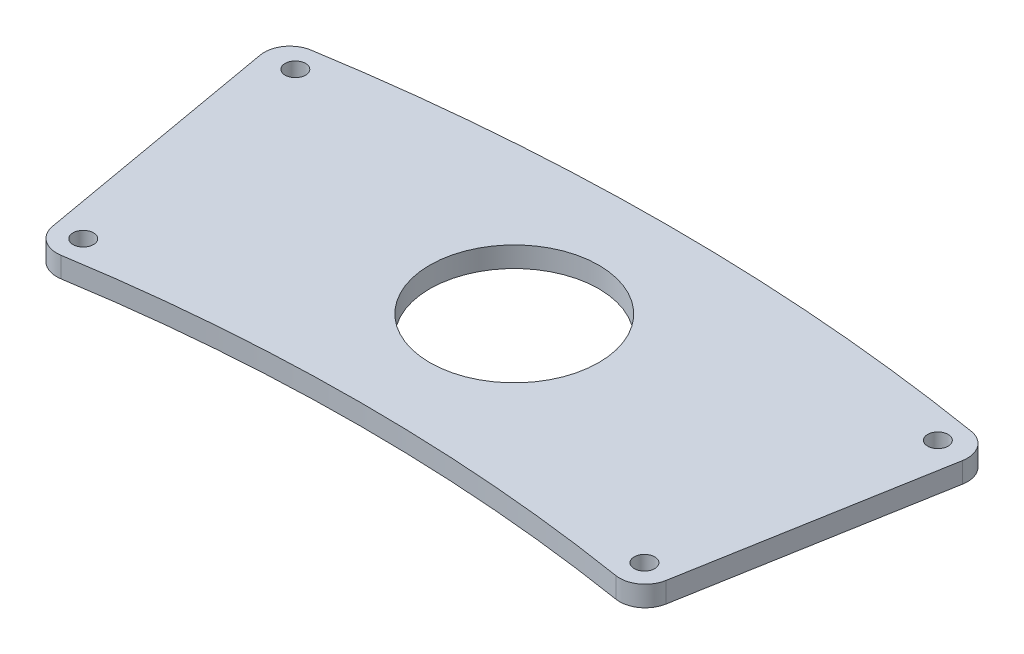
ISO-10303-21;
HEADER;
FILE_DESCRIPTION(('STEP AP214'),'2;1');
FILE_NAME('part.step','',(''),(''),'','','');
FILE_SCHEMA(('AUTOMOTIVE_DESIGN { 1 0 10303 214 1 1 1 1 }'));
ENDSEC;
DATA;
#1=APPLICATION_CONTEXT('core data for automotive mechanical design processes');
#2=APPLICATION_PROTOCOL_DEFINITION('international standard','automotive_design',2000,#1);
#3=PRODUCT_CONTEXT('',#1,'mechanical');
#4=PRODUCT('Part','Part','',(#3));
#5=PRODUCT_RELATED_PRODUCT_CATEGORY('part','',(#4));
#6=PRODUCT_DEFINITION_FORMATION('','',#4);
#7=PRODUCT_DEFINITION_CONTEXT('part definition',#1,'design');
#8=PRODUCT_DEFINITION('design','',#6,#7);
#9=PRODUCT_DEFINITION_SHAPE('','',#8);
#10=(LENGTH_UNIT() NAMED_UNIT(*) SI_UNIT(.MILLI.,.METRE.));
#11=(NAMED_UNIT(*) PLANE_ANGLE_UNIT() SI_UNIT($,.RADIAN.));
#12=(NAMED_UNIT(*) SI_UNIT($,.STERADIAN.) SOLID_ANGLE_UNIT());
#13=UNCERTAINTY_MEASURE_WITH_UNIT(LENGTH_MEASURE(1.E-05),#10,'distance_accuracy_value','');
#14=(GEOMETRIC_REPRESENTATION_CONTEXT(3) GLOBAL_UNCERTAINTY_ASSIGNED_CONTEXT((#13)) GLOBAL_UNIT_ASSIGNED_CONTEXT((#10,
#11,#12)) REPRESENTATION_CONTEXT('',''));
#15=CARTESIAN_POINT('',(0.,0.,0.));
#16=DIRECTION('',(0.,0.,1.));
#17=DIRECTION('',(1.,0.,0.));
#18=AXIS2_PLACEMENT_3D('',#15,#16,#17);
#19=CARTESIAN_POINT('',(0.,-4.,0.));
#20=DIRECTION('',(0.,1.,0.));
#21=DIRECTION('',(0.,0.,1.));
#22=AXIS2_PLACEMENT_3D('',#19,#20,#21);
#23=CYLINDRICAL_SURFACE('',#22,340.);
#24=CARTESIAN_POINT('',(0.,0.,0.));
#25=DIRECTION('',(0.,-1.,0.));
#26=DIRECTION('',(0.,0.,1.));
#27=AXIS2_PLACEMENT_3D('',#24,#25,#26);
#28=CIRCLE('',#27,340.);
#29=CARTESIAN_POINT('',(-54.1815037787085,0.,-335.655127546531));
#30=VERTEX_POINT('',#29);
#31=CARTESIAN_POINT('',(54.1815037787058,0.,-335.655127546531));
#32=VERTEX_POINT('',#31);
#33=EDGE_CURVE('E159',#30,#32,#28,.T.);
#34=ORIENTED_EDGE('',*,*,#33,.F.);
#35=DIRECTION('',(0.,1.,0.));
#36=VECTOR('',#35,1.);
#37=CARTESIAN_POINT('',(-54.1815037787085,-4.,-335.655127546531));
#38=LINE('',#37,#36);
#39=CARTESIAN_POINT('',(-54.1815037787085,-4.,-335.655127546531));
#40=VERTEX_POINT('',#39);
#41=EDGE_CURVE('E150',#30,#40,#38,.F.);
#42=ORIENTED_EDGE('',*,*,#41,.T.);
#43=CARTESIAN_POINT('',(0.,-4.,0.));
#44=DIRECTION('',(0.,-1.,0.));
#45=DIRECTION('',(0.,0.,1.));
#46=AXIS2_PLACEMENT_3D('',#43,#44,#45);
#47=CIRCLE('',#46,340.);
#48=CARTESIAN_POINT('',(54.1815037787058,-4.,-335.655127546531));
#49=VERTEX_POINT('',#48);
#50=EDGE_CURVE('E156',#40,#49,#47,.T.);
#51=ORIENTED_EDGE('',*,*,#50,.T.);
#52=DIRECTION('',(0.,1.,0.));
#53=VECTOR('',#52,1.);
#54=CARTESIAN_POINT('',(54.1815037787058,-4.,-335.655127546531));
#55=LINE('',#54,#53);
#56=EDGE_CURVE('E147',#49,#32,#55,.T.);
#57=ORIENTED_EDGE('',*,*,#56,.T.);
#58=EDGE_LOOP('',(#34,#42,#51,#57));
#59=FACE_BOUND('',#58,.T.);
#60=ADVANCED_FACE('F36',(#59),#23,.F.);
#61=CARTESIAN_POINT('',(-59.0403804067566,-4.,-334.834636024151));
#62=DIRECTION('',(-0.984807753012208,0.,0.173648177666931));
#63=DIRECTION('',(0.173648177666931,0.,0.984807753012208));
#64=AXIS2_PLACEMENT_3D('',#61,#62,#63);
#65=PLANE('',#64);
#66=DIRECTION('',(0.173648177666931,0.,0.984807753012208));
#67=VECTOR('',#66,1.);
#68=CARTESIAN_POINT('',(-59.0403804067566,0.,-334.834636024151));
#69=LINE('',#68,#67);
#70=CARTESIAN_POINT('',(-68.5855347627996,0.,-388.967896389022));
#71=VERTEX_POINT('',#70);
#72=CARTESIAN_POINT('',(-59.9023293640447,0.,-339.722991475057));
#73=VERTEX_POINT('',#72);
#74=EDGE_CURVE('E120',#71,#73,#69,.T.);
#75=ORIENTED_EDGE('',*,*,#74,.F.);
#76=DIRECTION('',(0.,1.,0.));
#77=VECTOR('',#76,1.);
#78=CARTESIAN_POINT('',(-68.5855347627996,-4.,-388.967896389022));
#79=LINE('',#78,#77);
#80=CARTESIAN_POINT('',(-68.5855347627996,-4.,-388.967896389022));
#81=VERTEX_POINT('',#80);
#82=EDGE_CURVE('E138',#71,#81,#79,.F.);
#83=ORIENTED_EDGE('',*,*,#82,.T.);
#84=DIRECTION('',(0.173648177666931,0.,0.984807753012208));
#85=VECTOR('',#84,1.);
#86=CARTESIAN_POINT('',(-59.0403804067566,-4.,-334.834636024151));
#87=LINE('',#86,#85);
#88=CARTESIAN_POINT('',(-59.9023293640447,-4.,-339.722991475057));
#89=VERTEX_POINT('',#88);
#90=EDGE_CURVE('E123',#81,#89,#87,.T.);
#91=ORIENTED_EDGE('',*,*,#90,.T.);
#92=DIRECTION('',(0.,1.,0.));
#93=VECTOR('',#92,1.);
#94=CARTESIAN_POINT('',(-59.9023293640447,-4.,-339.722991475057));
#95=LINE('',#94,#93);
#96=EDGE_CURVE('E135',#89,#73,#95,.T.);
#97=ORIENTED_EDGE('',*,*,#96,.T.);
#98=EDGE_LOOP('',(#75,#83,#91,#97));
#99=FACE_BOUND('',#98,.T.);
#100=ADVANCED_FACE('F172',(#99),#65,.T.);
#101=CARTESIAN_POINT('',(0.,-4.,0.));
#102=DIRECTION('',(0.,1.,0.));
#103=DIRECTION('',(0.,0.,1.));
#104=AXIS2_PLACEMENT_3D('',#101,#102,#103);
#105=CYLINDRICAL_SURFACE('',#104,400.);
#106=CARTESIAN_POINT('',(0.,-4.,0.));
#107=DIRECTION('',(0.,1.,0.));
#108=DIRECTION('',(0.,0.,1.));
#109=AXIS2_PLACEMENT_3D('',#106,#107,#108);
#110=CIRCLE('',#109,400.);
#111=CARTESIAN_POINT('',(64.4673377192258,-4.,-394.770771926437));
#112=VERTEX_POINT('',#111);
#113=CARTESIAN_POINT('',(-64.467337719229,-4.,-394.770771926437));
#114=VERTEX_POINT('',#113);
#115=EDGE_CURVE('E127',#112,#114,#110,.T.);
#116=ORIENTED_EDGE('',*,*,#115,.T.);
#117=DIRECTION('',(0.,1.,0.));
#118=VECTOR('',#117,1.);
#119=CARTESIAN_POINT('',(-64.467337719229,-4.,-394.770771926437));
#120=LINE('',#119,#118);
#121=CARTESIAN_POINT('',(-64.467337719229,0.,-394.770771926437));
#122=VERTEX_POINT('',#121);
#123=EDGE_CURVE('E119',#114,#122,#120,.T.);
#124=ORIENTED_EDGE('',*,*,#123,.T.);
#125=CARTESIAN_POINT('',(0.,0.,0.));
#126=DIRECTION('',(0.,1.,0.));
#127=DIRECTION('',(0.,0.,1.));
#128=AXIS2_PLACEMENT_3D('',#125,#126,#127);
#129=CIRCLE('',#128,400.);
#130=CARTESIAN_POINT('',(64.4673377192258,0.,-394.770771926437));
#131=VERTEX_POINT('',#130);
#132=EDGE_CURVE('E105',#131,#122,#129,.T.);
#133=ORIENTED_EDGE('',*,*,#132,.F.);
#134=DIRECTION('',(0.,1.,0.));
#135=VECTOR('',#134,1.);
#136=CARTESIAN_POINT('',(64.4673377192258,-4.,-394.770771926438));
#137=LINE('',#136,#135);
#138=EDGE_CURVE('E117',#131,#112,#137,.F.);
#139=ORIENTED_EDGE('',*,*,#138,.T.);
#140=EDGE_LOOP('',(#116,#124,#133,#139));
#141=FACE_BOUND('',#140,.T.);
#142=ADVANCED_FACE('F116',(#141),#105,.T.);
#143=CARTESIAN_POINT('',(69.4592710667694,-4.,-393.923101204884));
#144=DIRECTION('',(0.984807753012209,0.,0.173648177666924));
#145=DIRECTION('',(0.173648177666924,0.,-0.984807753012209));
#146=AXIS2_PLACEMENT_3D('',#143,#144,#145);
#147=PLANE('',#146);
#148=DIRECTION('',(0.173648177666924,0.,-0.984807753012209));
#149=VECTOR('',#148,1.);
#150=CARTESIAN_POINT('',(69.4592710667694,-4.,-393.923101204884));
#151=LINE('',#150,#149);
#152=CARTESIAN_POINT('',(59.902329364042,-4.,-339.722991475057));
#153=VERTEX_POINT('',#152);
#154=CARTESIAN_POINT('',(68.5855347627966,-4.,-388.967896389023));
#155=VERTEX_POINT('',#154);
#156=EDGE_CURVE('E165',#153,#155,#151,.T.);
#157=ORIENTED_EDGE('',*,*,#156,.T.);
#158=DIRECTION('',(0.,1.,0.));
#159=VECTOR('',#158,1.);
#160=CARTESIAN_POINT('',(68.5855347627966,-4.,-388.967896389023));
#161=LINE('',#160,#159);
#162=CARTESIAN_POINT('',(68.5855347627966,0.,-388.967896389023));
#163=VERTEX_POINT('',#162);
#164=EDGE_CURVE('E11',#155,#163,#161,.T.);
#165=ORIENTED_EDGE('',*,*,#164,.T.);
#166=DIRECTION('',(0.173648177666924,0.,-0.984807753012209));
#167=VECTOR('',#166,1.);
#168=CARTESIAN_POINT('',(69.4592710667694,0.,-393.923101204884));
#169=LINE('',#168,#167);
#170=CARTESIAN_POINT('',(59.902329364042,0.,-339.722991475057));
#171=VERTEX_POINT('',#170);
#172=EDGE_CURVE('E106',#171,#163,#169,.T.);
#173=ORIENTED_EDGE('',*,*,#172,.F.);
#174=DIRECTION('',(0.,1.,0.));
#175=VECTOR('',#174,1.);
#176=CARTESIAN_POINT('',(59.902329364042,-4.,-339.722991475057));
#177=LINE('',#176,#175);
#178=EDGE_CURVE('E44',#171,#153,#177,.F.);
#179=ORIENTED_EDGE('',*,*,#178,.T.);
#180=EDGE_LOOP('',(#157,#165,#173,#179));
#181=FACE_BOUND('',#180,.T.);
#182=ADVANCED_FACE('F249',(#181),#147,.T.);
#183=CARTESIAN_POINT('',(0.,-4.,0.));
#184=DIRECTION('',(0.,1.,0.));
#185=DIRECTION('',(0.,0.,1.));
#186=AXIS2_PLACEMENT_3D('',#183,#184,#185);
#187=PLANE('',#186);
#188=CARTESIAN_POINT('',(-62.748327316844,-4.,-389.984163036063));
#189=DIRECTION('',(0.,1.,0.));
#190=DIRECTION('',(0.,0.,1.));
#191=AXIS2_PLACEMENT_3D('',#188,#189,#190);
#192=CIRCLE('',#191,2.);
#193=CARTESIAN_POINT('',(-62.748327316844,-4.,-387.984163036063));
#194=VERTEX_POINT('',#193);
#195=EDGE_CURVE('E208',#194,#194,#192,.T.);
#196=ORIENTED_EDGE('',*,*,#195,.T.);
#197=EDGE_LOOP('',(#196));
#198=FACE_BOUND('',#197,.T.);
#199=CARTESIAN_POINT('',(-54.8055010742055,-4.,-340.619079107447));
#200=DIRECTION('',(0.,1.,0.));
#201=DIRECTION('',(0.,0.,1.));
#202=AXIS2_PLACEMENT_3D('',#199,#200,#201);
#203=CIRCLE('',#202,2.);
#204=CARTESIAN_POINT('',(-54.8055010742055,-4.,-338.619079107447));
#205=VERTEX_POINT('',#204);
#206=EDGE_CURVE('E202',#205,#205,#203,.T.);
#207=ORIENTED_EDGE('',*,*,#206,.T.);
#208=EDGE_LOOP('',(#207));
#209=FACE_BOUND('',#208,.T.);
#210=CARTESIAN_POINT('',(54.8055010742028,-4.,-340.619079107447));
#211=DIRECTION('',(0.,1.,0.));
#212=DIRECTION('',(0.,0.,1.));
#213=AXIS2_PLACEMENT_3D('',#210,#211,#212);
#214=CIRCLE('',#213,2.);
#215=CARTESIAN_POINT('',(54.8055010742028,-4.,-338.619079107447));
#216=VERTEX_POINT('',#215);
#217=EDGE_CURVE('E196',#216,#216,#214,.T.);
#218=ORIENTED_EDGE('',*,*,#217,.T.);
#219=EDGE_LOOP('',(#218));
#220=FACE_BOUND('',#219,.T.);
#221=CARTESIAN_POINT('',(62.7483273168409,-4.,-389.984163036063));
#222=DIRECTION('',(0.,1.,0.));
#223=DIRECTION('',(0.,0.,1.));
#224=AXIS2_PLACEMENT_3D('',#221,#222,#223);
#225=CIRCLE('',#224,2.);
#226=CARTESIAN_POINT('',(62.7483273168409,-4.,-387.984163036063));
#227=VERTEX_POINT('',#226);
#228=EDGE_CURVE('E188',#227,#227,#225,.T.);
#229=ORIENTED_EDGE('',*,*,#228,.T.);
#230=EDGE_LOOP('',(#229));
#231=FACE_BOUND('',#230,.T.);
#232=CARTESIAN_POINT('',(0.,-4.,-370.));
#233=DIRECTION('',(0.,1.,0.));
#234=DIRECTION('',(0.,0.,1.));
#235=AXIS2_PLACEMENT_3D('',#232,#233,#234);
#236=CIRCLE('',#235,16.5);
#237=CARTESIAN_POINT('',(0.,-4.,-353.5));
#238=VERTEX_POINT('',#237);
#239=EDGE_CURVE('E181',#238,#238,#236,.T.);
#240=ORIENTED_EDGE('',*,*,#239,.T.);
#241=EDGE_LOOP('',(#240));
#242=FACE_BOUND('',#241,.T.);
#243=ORIENTED_EDGE('',*,*,#90,.F.);
#244=CARTESIAN_POINT('',(-63.6614959977386,-4.,-389.836137277356));
#245=DIRECTION('',(0.,1.,0.));
#246=DIRECTION('',(0.,0.,1.));
#247=AXIS2_PLACEMENT_3D('',#244,#245,#246);
#248=CIRCLE('',#247,5.);
#249=EDGE_CURVE('E145',#81,#114,#248,.F.);
#250=ORIENTED_EDGE('',*,*,#249,.T.);
#251=ORIENTED_EDGE('',*,*,#115,.F.);
#252=CARTESIAN_POINT('',(63.6614959977355,-4.,-389.836137277357));
#253=DIRECTION('',(0.,1.,0.));
#254=DIRECTION('',(0.,0.,1.));
#255=AXIS2_PLACEMENT_3D('',#252,#253,#254);
#256=CIRCLE('',#255,5.);
#257=EDGE_CURVE('E51',#112,#155,#256,.F.);
#258=ORIENTED_EDGE('',*,*,#257,.T.);
#259=ORIENTED_EDGE('',*,*,#156,.F.);
#260=CARTESIAN_POINT('',(54.9782905989809,-4.,-340.591232363392));
#261=DIRECTION('',(0.,1.,0.));
#262=DIRECTION('',(0.,0.,1.));
#263=AXIS2_PLACEMENT_3D('',#260,#261,#262);
#264=CIRCLE('',#263,5.);
#265=EDGE_CURVE('E140',#153,#49,#264,.F.);
#266=ORIENTED_EDGE('',*,*,#265,.T.);
#267=ORIENTED_EDGE('',*,*,#50,.F.);
#268=CARTESIAN_POINT('',(-54.9782905989836,-4.,-340.591232363391));
#269=DIRECTION('',(0.,1.,0.));
#270=DIRECTION('',(0.,0.,1.));
#271=AXIS2_PLACEMENT_3D('',#268,#269,#270);
#272=CIRCLE('',#271,5.);
#273=EDGE_CURVE('E143',#40,#89,#272,.F.);
#274=ORIENTED_EDGE('',*,*,#273,.T.);
#275=EDGE_LOOP('',(#243,#250,#251,#258,#259,#266,#267,#274));
#276=FACE_BOUND('',#275,.T.);
#277=ADVANCED_FACE('F163',(#198,#209,#220,#231,#242,#276),#187,.F.);
#278=CARTESIAN_POINT('',(0.,0.,0.));
#279=DIRECTION('',(0.,1.,0.));
#280=DIRECTION('',(0.,0.,1.));
#281=AXIS2_PLACEMENT_3D('',#278,#279,#280);
#282=PLANE('',#281);
#283=CARTESIAN_POINT('',(-62.748327316844,0.,-389.984163036063));
#284=DIRECTION('',(0.,1.,0.));
#285=DIRECTION('',(0.,0.,1.));
#286=AXIS2_PLACEMENT_3D('',#283,#284,#285);
#287=CIRCLE('',#286,2.);
#288=CARTESIAN_POINT('',(-62.748327316844,0.,-387.984163036063));
#289=VERTEX_POINT('',#288);
#290=EDGE_CURVE('E211',#289,#289,#287,.T.);
#291=ORIENTED_EDGE('',*,*,#290,.F.);
#292=EDGE_LOOP('',(#291));
#293=FACE_BOUND('',#292,.T.);
#294=CARTESIAN_POINT('',(-54.8055010742055,0.,-340.619079107447));
#295=DIRECTION('',(0.,1.,0.));
#296=DIRECTION('',(0.,0.,1.));
#297=AXIS2_PLACEMENT_3D('',#294,#295,#296);
#298=CIRCLE('',#297,2.);
#299=CARTESIAN_POINT('',(-54.8055010742055,0.,-338.619079107447));
#300=VERTEX_POINT('',#299);
#301=EDGE_CURVE('E205',#300,#300,#298,.T.);
#302=ORIENTED_EDGE('',*,*,#301,.F.);
#303=EDGE_LOOP('',(#302));
#304=FACE_BOUND('',#303,.T.);
#305=CARTESIAN_POINT('',(54.8055010742028,0.,-340.619079107447));
#306=DIRECTION('',(0.,1.,0.));
#307=DIRECTION('',(0.,0.,1.));
#308=AXIS2_PLACEMENT_3D('',#305,#306,#307);
#309=CIRCLE('',#308,2.);
#310=CARTESIAN_POINT('',(54.8055010742028,0.,-338.619079107447));
#311=VERTEX_POINT('',#310);
#312=EDGE_CURVE('E199',#311,#311,#309,.T.);
#313=ORIENTED_EDGE('',*,*,#312,.F.);
#314=EDGE_LOOP('',(#313));
#315=FACE_BOUND('',#314,.T.);
#316=CARTESIAN_POINT('',(62.7483273168409,0.,-389.984163036063));
#317=DIRECTION('',(0.,1.,0.));
#318=DIRECTION('',(0.,0.,1.));
#319=AXIS2_PLACEMENT_3D('',#316,#317,#318);
#320=CIRCLE('',#319,2.);
#321=CARTESIAN_POINT('',(62.7483273168409,0.,-387.984163036063));
#322=VERTEX_POINT('',#321);
#323=EDGE_CURVE('E193',#322,#322,#320,.T.);
#324=ORIENTED_EDGE('',*,*,#323,.F.);
#325=EDGE_LOOP('',(#324));
#326=FACE_BOUND('',#325,.T.);
#327=CARTESIAN_POINT('',(0.,0.,-370.));
#328=DIRECTION('',(0.,1.,0.));
#329=DIRECTION('',(0.,0.,1.));
#330=AXIS2_PLACEMENT_3D('',#327,#328,#329);
#331=CIRCLE('',#330,16.5);
#332=CARTESIAN_POINT('',(0.,0.,-353.5));
#333=VERTEX_POINT('',#332);
#334=EDGE_CURVE('E183',#333,#333,#331,.T.);
#335=ORIENTED_EDGE('',*,*,#334,.F.);
#336=EDGE_LOOP('',(#335));
#337=FACE_BOUND('',#336,.T.);
#338=ORIENTED_EDGE('',*,*,#132,.T.);
#339=CARTESIAN_POINT('',(-63.6614959977386,0.,-389.836137277356));
#340=DIRECTION('',(0.,1.,0.));
#341=DIRECTION('',(0.,0.,1.));
#342=AXIS2_PLACEMENT_3D('',#339,#340,#341);
#343=CIRCLE('',#342,5.);
#344=EDGE_CURVE('E133',#122,#71,#343,.T.);
#345=ORIENTED_EDGE('',*,*,#344,.T.);
#346=ORIENTED_EDGE('',*,*,#74,.T.);
#347=CARTESIAN_POINT('',(-54.9782905989836,0.,-340.591232363391));
#348=DIRECTION('',(0.,1.,0.));
#349=DIRECTION('',(0.,0.,1.));
#350=AXIS2_PLACEMENT_3D('',#347,#348,#349);
#351=CIRCLE('',#350,5.);
#352=EDGE_CURVE('E110',#73,#30,#351,.T.);
#353=ORIENTED_EDGE('',*,*,#352,.T.);
#354=ORIENTED_EDGE('',*,*,#33,.T.);
#355=CARTESIAN_POINT('',(54.9782905989809,0.,-340.591232363392));
#356=DIRECTION('',(0.,1.,0.));
#357=DIRECTION('',(0.,0.,1.));
#358=AXIS2_PLACEMENT_3D('',#355,#356,#357);
#359=CIRCLE('',#358,5.);
#360=EDGE_CURVE('E111',#32,#171,#359,.T.);
#361=ORIENTED_EDGE('',*,*,#360,.T.);
#362=ORIENTED_EDGE('',*,*,#172,.T.);
#363=CARTESIAN_POINT('',(63.6614959977355,0.,-389.836137277357));
#364=DIRECTION('',(0.,1.,0.));
#365=DIRECTION('',(0.,0.,1.));
#366=AXIS2_PLACEMENT_3D('',#363,#364,#365);
#367=CIRCLE('',#366,5.);
#368=EDGE_CURVE('E102',#163,#131,#367,.T.);
#369=ORIENTED_EDGE('',*,*,#368,.T.);
#370=EDGE_LOOP('',(#338,#345,#346,#353,#354,#361,#362,#369));
#371=FACE_BOUND('',#370,.T.);
#372=ADVANCED_FACE('F104',(#293,#304,#315,#326,#337,#371),#282,.T.);
#373=CARTESIAN_POINT('',(0.,-4.,-370.));
#374=DIRECTION('',(0.,1.,0.));
#375=DIRECTION('',(0.,0.,1.));
#376=AXIS2_PLACEMENT_3D('',#373,#374,#375);
#377=CYLINDRICAL_SURFACE('',#376,16.5);
#378=ORIENTED_EDGE('',*,*,#239,.F.);
#379=EDGE_LOOP('',(#378));
#380=FACE_BOUND('',#379,.T.);
#381=ORIENTED_EDGE('',*,*,#334,.T.);
#382=EDGE_LOOP('',(#381));
#383=FACE_BOUND('',#382,.T.);
#384=ADVANCED_FACE('F220',(#380,#383),#377,.F.);
#385=CARTESIAN_POINT('',(62.7483273168409,-10.,-389.984163036063));
#386=DIRECTION('',(0.,1.,0.));
#387=DIRECTION('',(0.,0.,1.));
#388=AXIS2_PLACEMENT_3D('',#385,#386,#387);
#389=CYLINDRICAL_SURFACE('',#388,2.);
#390=ORIENTED_EDGE('',*,*,#323,.T.);
#391=EDGE_LOOP('',(#390));
#392=FACE_BOUND('',#391,.T.);
#393=ORIENTED_EDGE('',*,*,#228,.F.);
#394=EDGE_LOOP('',(#393));
#395=FACE_BOUND('',#394,.T.);
#396=ADVANCED_FACE('F231',(#392,#395),#389,.F.);
#397=CARTESIAN_POINT('',(54.8055010742028,-10.,-340.619079107447));
#398=DIRECTION('',(0.,1.,0.));
#399=DIRECTION('',(0.,0.,1.));
#400=AXIS2_PLACEMENT_3D('',#397,#398,#399);
#401=CYLINDRICAL_SURFACE('',#400,2.);
#402=ORIENTED_EDGE('',*,*,#312,.T.);
#403=EDGE_LOOP('',(#402));
#404=FACE_BOUND('',#403,.T.);
#405=ORIENTED_EDGE('',*,*,#217,.F.);
#406=EDGE_LOOP('',(#405));
#407=FACE_BOUND('',#406,.T.);
#408=ADVANCED_FACE('F237',(#404,#407),#401,.F.);
#409=CARTESIAN_POINT('',(-54.8055010742055,-10.,-340.619079107447));
#410=DIRECTION('',(0.,1.,0.));
#411=DIRECTION('',(0.,0.,1.));
#412=AXIS2_PLACEMENT_3D('',#409,#410,#411);
#413=CYLINDRICAL_SURFACE('',#412,2.);
#414=ORIENTED_EDGE('',*,*,#301,.T.);
#415=EDGE_LOOP('',(#414));
#416=FACE_BOUND('',#415,.T.);
#417=ORIENTED_EDGE('',*,*,#206,.F.);
#418=EDGE_LOOP('',(#417));
#419=FACE_BOUND('',#418,.T.);
#420=ADVANCED_FACE('F288',(#416,#419),#413,.F.);
#421=CARTESIAN_POINT('',(-62.748327316844,-10.,-389.984163036063));
#422=DIRECTION('',(0.,1.,0.));
#423=DIRECTION('',(0.,0.,1.));
#424=AXIS2_PLACEMENT_3D('',#421,#422,#423);
#425=CYLINDRICAL_SURFACE('',#424,2.);
#426=ORIENTED_EDGE('',*,*,#290,.T.);
#427=EDGE_LOOP('',(#426));
#428=FACE_BOUND('',#427,.T.);
#429=ORIENTED_EDGE('',*,*,#195,.F.);
#430=EDGE_LOOP('',(#429));
#431=FACE_BOUND('',#430,.T.);
#432=ADVANCED_FACE('F215',(#428,#431),#425,.F.);
#433=CARTESIAN_POINT('',(-63.6614959977386,-4.,-389.836137277356));
#434=DIRECTION('',(0.,1.,0.));
#435=DIRECTION('',(0.,0.,1.));
#436=AXIS2_PLACEMENT_3D('',#433,#434,#435);
#437=CYLINDRICAL_SURFACE('',#436,5.);
#438=ORIENTED_EDGE('',*,*,#249,.F.);
#439=ORIENTED_EDGE('',*,*,#82,.F.);
#440=ORIENTED_EDGE('',*,*,#344,.F.);
#441=ORIENTED_EDGE('',*,*,#123,.F.);
#442=EDGE_LOOP('',(#438,#439,#440,#441));
#443=FACE_BOUND('',#442,.T.);
#444=ADVANCED_FACE('F176',(#443),#437,.T.);
#445=CARTESIAN_POINT('',(-54.9782905989836,-4.,-340.591232363391));
#446=DIRECTION('',(0.,1.,0.));
#447=DIRECTION('',(0.,0.,1.));
#448=AXIS2_PLACEMENT_3D('',#445,#446,#447);
#449=CYLINDRICAL_SURFACE('',#448,5.);
#450=ORIENTED_EDGE('',*,*,#273,.F.);
#451=ORIENTED_EDGE('',*,*,#41,.F.);
#452=ORIENTED_EDGE('',*,*,#352,.F.);
#453=ORIENTED_EDGE('',*,*,#96,.F.);
#454=EDGE_LOOP('',(#450,#451,#452,#453));
#455=FACE_BOUND('',#454,.T.);
#456=ADVANCED_FACE('F168',(#455),#449,.T.);
#457=CARTESIAN_POINT('',(63.6614959977355,-4.,-389.836137277357));
#458=DIRECTION('',(0.,1.,0.));
#459=DIRECTION('',(0.,0.,1.));
#460=AXIS2_PLACEMENT_3D('',#457,#458,#459);
#461=CYLINDRICAL_SURFACE('',#460,5.);
#462=ORIENTED_EDGE('',*,*,#257,.F.);
#463=ORIENTED_EDGE('',*,*,#138,.F.);
#464=ORIENTED_EDGE('',*,*,#368,.F.);
#465=ORIENTED_EDGE('',*,*,#164,.F.);
#466=EDGE_LOOP('',(#462,#463,#464,#465));
#467=FACE_BOUND('',#466,.T.);
#468=ADVANCED_FACE('F122',(#467),#461,.T.);
#469=CARTESIAN_POINT('',(54.9782905989809,-4.,-340.591232363392));
#470=DIRECTION('',(0.,1.,0.));
#471=DIRECTION('',(0.,0.,1.));
#472=AXIS2_PLACEMENT_3D('',#469,#470,#471);
#473=CYLINDRICAL_SURFACE('',#472,5.);
#474=ORIENTED_EDGE('',*,*,#265,.F.);
#475=ORIENTED_EDGE('',*,*,#178,.F.);
#476=ORIENTED_EDGE('',*,*,#360,.F.);
#477=ORIENTED_EDGE('',*,*,#56,.F.);
#478=EDGE_LOOP('',(#474,#475,#476,#477));
#479=FACE_BOUND('',#478,.T.);
#480=ADVANCED_FACE('F38',(#479),#473,.T.);
#481=CLOSED_SHELL('',(#60,#100,#142,#182,#277,#372,#384,#396,#408,#420,#432,#444,#456,#468,#480));
#482=MANIFOLD_SOLID_BREP('B2',#481);
#483=ADVANCED_BREP_SHAPE_REPRESENTATION('',(#18,#482),#14);
#484=SHAPE_DEFINITION_REPRESENTATION(#9,#483);
ENDSEC;
END-ISO-10303-21;
